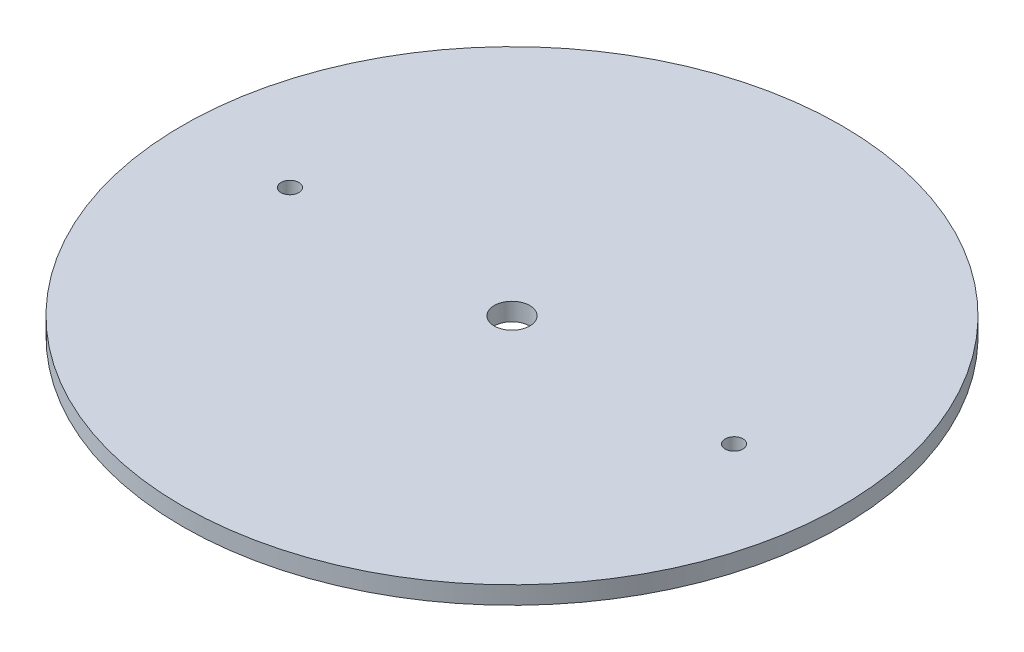
ISO-10303-21;
HEADER;
FILE_DESCRIPTION(('STEP AP214'),'2;1');
FILE_NAME('part.step','',(''),(''),'','','');
FILE_SCHEMA(('AUTOMOTIVE_DESIGN { 1 0 10303 214 1 1 1 1 }'));
ENDSEC;
DATA;
#1=APPLICATION_CONTEXT('core data for automotive mechanical design processes');
#2=APPLICATION_PROTOCOL_DEFINITION('international standard','automotive_design',2000,#1);
#3=PRODUCT_CONTEXT('',#1,'mechanical');
#4=PRODUCT('Part','Part','',(#3));
#5=PRODUCT_RELATED_PRODUCT_CATEGORY('part','',(#4));
#6=PRODUCT_DEFINITION_FORMATION('','',#4);
#7=PRODUCT_DEFINITION_CONTEXT('part definition',#1,'design');
#8=PRODUCT_DEFINITION('design','',#6,#7);
#9=PRODUCT_DEFINITION_SHAPE('','',#8);
#10=(LENGTH_UNIT() NAMED_UNIT(*) SI_UNIT(.MILLI.,.METRE.));
#11=(NAMED_UNIT(*) PLANE_ANGLE_UNIT() SI_UNIT($,.RADIAN.));
#12=(NAMED_UNIT(*) SI_UNIT($,.STERADIAN.) SOLID_ANGLE_UNIT());
#13=UNCERTAINTY_MEASURE_WITH_UNIT(LENGTH_MEASURE(1.E-05),#10,'distance_accuracy_value','');
#14=(GEOMETRIC_REPRESENTATION_CONTEXT(3) GLOBAL_UNCERTAINTY_ASSIGNED_CONTEXT((#13)) GLOBAL_UNIT_ASSIGNED_CONTEXT((#10,
#11,#12)) REPRESENTATION_CONTEXT('',''));
#15=CARTESIAN_POINT('',(0.,0.,0.));
#16=DIRECTION('',(0.,0.,1.));
#17=DIRECTION('',(1.,0.,0.));
#18=AXIS2_PLACEMENT_3D('',#15,#16,#17);
#19=CARTESIAN_POINT('',(0.,4.,0.));
#20=DIRECTION('',(0.,1.,0.));
#21=DIRECTION('',(0.,0.,1.));
#22=AXIS2_PLACEMENT_3D('',#19,#20,#21);
#23=PLANE('',#22);
#24=CARTESIAN_POINT('',(-50.,4.,0.));
#25=DIRECTION('',(0.,1.,0.));
#26=DIRECTION('',(0.,0.,1.));
#27=AXIS2_PLACEMENT_3D('',#24,#25,#26);
#28=CIRCLE('',#27,2.);
#29=CARTESIAN_POINT('',(-50.,4.,2.00000000000001));
#30=VERTEX_POINT('',#29);
#31=EDGE_CURVE('E56',#30,#30,#28,.T.);
#32=ORIENTED_EDGE('',*,*,#31,.F.);
#33=EDGE_LOOP('',(#32));
#34=FACE_BOUND('',#33,.T.);
#35=CARTESIAN_POINT('',(0.,4.,0.));
#36=DIRECTION('',(0.,1.,0.));
#37=DIRECTION('',(0.,0.,1.));
#38=AXIS2_PLACEMENT_3D('',#35,#36,#37);
#39=CIRCLE('',#38,74.2);
#40=CARTESIAN_POINT('',(0.,4.,74.2));
#41=VERTEX_POINT('',#40);
#42=EDGE_CURVE('E10',#41,#41,#39,.T.);
#43=ORIENTED_EDGE('',*,*,#42,.T.);
#44=EDGE_LOOP('',(#43));
#45=FACE_BOUND('',#44,.T.);
#46=CARTESIAN_POINT('',(0.,4.,0.));
#47=DIRECTION('',(0.,1.,0.));
#48=DIRECTION('',(0.,0.,1.));
#49=AXIS2_PLACEMENT_3D('',#46,#47,#48);
#50=CIRCLE('',#49,4.);
#51=CARTESIAN_POINT('',(0.,4.,4.));
#52=VERTEX_POINT('',#51);
#53=EDGE_CURVE('E50',#52,#52,#50,.T.);
#54=ORIENTED_EDGE('',*,*,#53,.F.);
#55=EDGE_LOOP('',(#54));
#56=FACE_BOUND('',#55,.T.);
#57=CARTESIAN_POINT('',(50.,4.,0.));
#58=DIRECTION('',(0.,1.,0.));
#59=DIRECTION('',(0.,0.,-1.));
#60=AXIS2_PLACEMENT_3D('',#57,#58,#59);
#61=CIRCLE('',#60,2.);
#62=CARTESIAN_POINT('',(50.,4.,-2.));
#63=VERTEX_POINT('',#62);
#64=EDGE_CURVE('E64',#63,#63,#61,.T.);
#65=ORIENTED_EDGE('',*,*,#64,.F.);
#66=EDGE_LOOP('',(#65));
#67=FACE_BOUND('',#66,.T.);
#68=ADVANCED_FACE('F37',(#34,#45,#56,#67),#23,.T.);
#69=CARTESIAN_POINT('',(0.,0.,0.));
#70=DIRECTION('',(0.,1.,0.));
#71=DIRECTION('',(0.,0.,1.));
#72=AXIS2_PLACEMENT_3D('',#69,#70,#71);
#73=PLANE('',#72);
#74=CARTESIAN_POINT('',(0.,0.,0.));
#75=DIRECTION('',(0.,1.,0.));
#76=DIRECTION('',(0.,0.,1.));
#77=AXIS2_PLACEMENT_3D('',#74,#75,#76);
#78=CIRCLE('',#77,74.2);
#79=CARTESIAN_POINT('',(0.,0.,74.2));
#80=VERTEX_POINT('',#79);
#81=EDGE_CURVE('E41',#80,#80,#78,.T.);
#82=ORIENTED_EDGE('',*,*,#81,.F.);
#83=EDGE_LOOP('',(#82));
#84=FACE_BOUND('',#83,.T.);
#85=CARTESIAN_POINT('',(0.,0.,0.));
#86=DIRECTION('',(0.,1.,0.));
#87=DIRECTION('',(0.,0.,1.));
#88=AXIS2_PLACEMENT_3D('',#85,#86,#87);
#89=CIRCLE('',#88,4.);
#90=CARTESIAN_POINT('',(0.,0.,4.));
#91=VERTEX_POINT('',#90);
#92=EDGE_CURVE('E52',#91,#91,#89,.T.);
#93=ORIENTED_EDGE('',*,*,#92,.T.);
#94=EDGE_LOOP('',(#93));
#95=FACE_BOUND('',#94,.T.);
#96=CARTESIAN_POINT('',(-50.,0.,0.));
#97=DIRECTION('',(0.,1.,0.));
#98=DIRECTION('',(0.,0.,1.));
#99=AXIS2_PLACEMENT_3D('',#96,#97,#98);
#100=CIRCLE('',#99,2.);
#101=CARTESIAN_POINT('',(-50.,0.,2.00000000000001));
#102=VERTEX_POINT('',#101);
#103=EDGE_CURVE('E60',#102,#102,#100,.T.);
#104=ORIENTED_EDGE('',*,*,#103,.T.);
#105=EDGE_LOOP('',(#104));
#106=FACE_BOUND('',#105,.T.);
#107=CARTESIAN_POINT('',(50.,0.,0.));
#108=DIRECTION('',(0.,1.,0.));
#109=DIRECTION('',(0.,0.,-1.));
#110=AXIS2_PLACEMENT_3D('',#107,#108,#109);
#111=CIRCLE('',#110,2.);
#112=CARTESIAN_POINT('',(50.,0.,-2.));
#113=VERTEX_POINT('',#112);
#114=EDGE_CURVE('E68',#113,#113,#111,.T.);
#115=ORIENTED_EDGE('',*,*,#114,.T.);
#116=EDGE_LOOP('',(#115));
#117=FACE_BOUND('',#116,.T.);
#118=ADVANCED_FACE('F80',(#84,#95,#106,#117),#73,.F.);
#119=CARTESIAN_POINT('',(0.,4.,0.));
#120=DIRECTION('',(0.,-1.,0.));
#121=DIRECTION('',(0.,0.,-1.));
#122=AXIS2_PLACEMENT_3D('',#119,#120,#121);
#123=CYLINDRICAL_SURFACE('',#122,74.2);
#124=ORIENTED_EDGE('',*,*,#42,.F.);
#125=EDGE_LOOP('',(#124));
#126=FACE_BOUND('',#125,.T.);
#127=ORIENTED_EDGE('',*,*,#81,.T.);
#128=EDGE_LOOP('',(#127));
#129=FACE_BOUND('',#128,.T.);
#130=ADVANCED_FACE('F39',(#126,#129),#123,.T.);
#131=CARTESIAN_POINT('',(0.,4.,0.));
#132=DIRECTION('',(0.,-1.,0.));
#133=DIRECTION('',(0.,0.,-1.));
#134=AXIS2_PLACEMENT_3D('',#131,#132,#133);
#135=CYLINDRICAL_SURFACE('',#134,4.);
#136=ORIENTED_EDGE('',*,*,#53,.T.);
#137=EDGE_LOOP('',(#136));
#138=FACE_BOUND('',#137,.T.);
#139=ORIENTED_EDGE('',*,*,#92,.F.);
#140=EDGE_LOOP('',(#139));
#141=FACE_BOUND('',#140,.T.);
#142=ADVANCED_FACE('F89',(#138,#141),#135,.F.);
#143=CARTESIAN_POINT('',(-50.,4.,0.));
#144=DIRECTION('',(0.,-1.,0.));
#145=DIRECTION('',(0.,0.,-1.));
#146=AXIS2_PLACEMENT_3D('',#143,#144,#145);
#147=CYLINDRICAL_SURFACE('',#146,2.);
#148=ORIENTED_EDGE('',*,*,#31,.T.);
#149=EDGE_LOOP('',(#148));
#150=FACE_BOUND('',#149,.T.);
#151=ORIENTED_EDGE('',*,*,#103,.F.);
#152=EDGE_LOOP('',(#151));
#153=FACE_BOUND('',#152,.T.);
#154=ADVANCED_FACE('F92',(#150,#153),#147,.F.);
#155=CARTESIAN_POINT('',(50.,4.,0.));
#156=DIRECTION('',(0.,-1.,0.));
#157=DIRECTION('',(0.,0.,-1.));
#158=AXIS2_PLACEMENT_3D('',#155,#156,#157);
#159=CYLINDRICAL_SURFACE('',#158,2.);
#160=ORIENTED_EDGE('',*,*,#64,.T.);
#161=EDGE_LOOP('',(#160));
#162=FACE_BOUND('',#161,.T.);
#163=ORIENTED_EDGE('',*,*,#114,.F.);
#164=EDGE_LOOP('',(#163));
#165=FACE_BOUND('',#164,.T.);
#166=ADVANCED_FACE('F76',(#162,#165),#159,.F.);
#167=CLOSED_SHELL('',(#68,#118,#130,#142,#154,#166));
#168=MANIFOLD_SOLID_BREP('B2',#167);
#169=ADVANCED_BREP_SHAPE_REPRESENTATION('',(#18,#168),#14);
#170=SHAPE_DEFINITION_REPRESENTATION(#9,#169);
ENDSEC;
END-ISO-10303-21;
